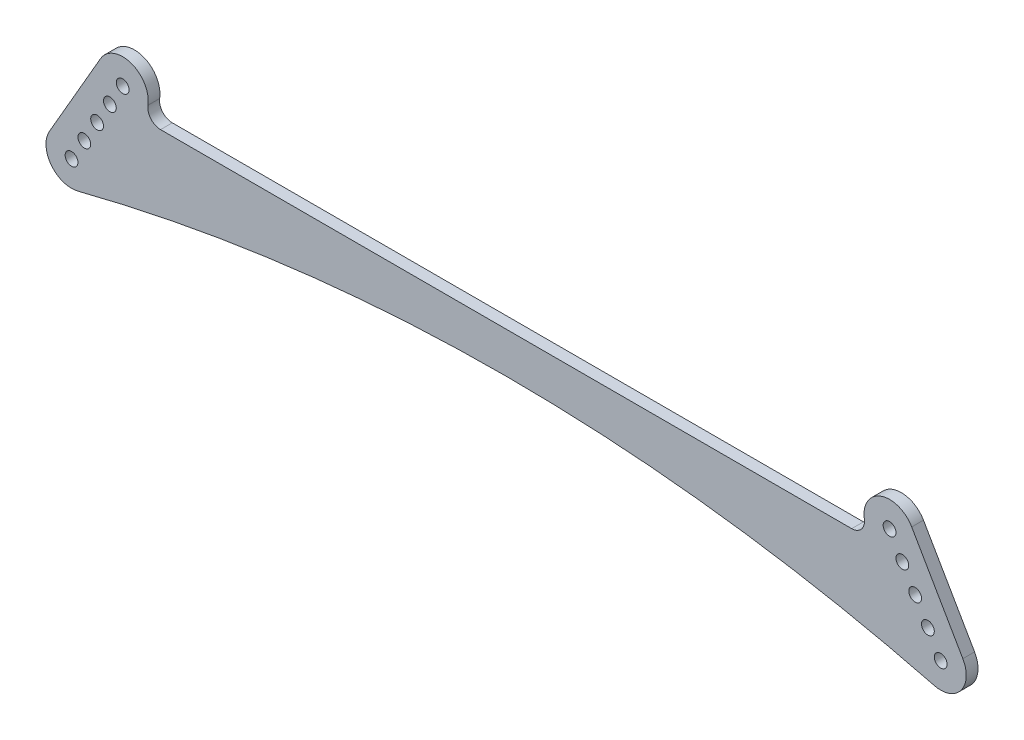
ISO-10303-21;
HEADER;
FILE_DESCRIPTION(('STEP AP214'),'2;1');
FILE_NAME('part.step','',(''),(''),'','','');
FILE_SCHEMA(('AUTOMOTIVE_DESIGN { 1 0 10303 214 1 1 1 1 }'));
ENDSEC;
DATA;
#1=APPLICATION_CONTEXT('core data for automotive mechanical design processes');
#2=APPLICATION_PROTOCOL_DEFINITION('international standard','automotive_design',2000,#1);
#3=PRODUCT_CONTEXT('',#1,'mechanical');
#4=PRODUCT('Part','Part','',(#3));
#5=PRODUCT_RELATED_PRODUCT_CATEGORY('part','',(#4));
#6=PRODUCT_DEFINITION_FORMATION('','',#4);
#7=PRODUCT_DEFINITION_CONTEXT('part definition',#1,'design');
#8=PRODUCT_DEFINITION('design','',#6,#7);
#9=PRODUCT_DEFINITION_SHAPE('','',#8);
#10=(LENGTH_UNIT() NAMED_UNIT(*) SI_UNIT(.MILLI.,.METRE.));
#11=(NAMED_UNIT(*) PLANE_ANGLE_UNIT() SI_UNIT($,.RADIAN.));
#12=(NAMED_UNIT(*) SI_UNIT($,.STERADIAN.) SOLID_ANGLE_UNIT());
#13=UNCERTAINTY_MEASURE_WITH_UNIT(LENGTH_MEASURE(1.E-05),#10,'distance_accuracy_value','');
#14=(GEOMETRIC_REPRESENTATION_CONTEXT(3) GLOBAL_UNCERTAINTY_ASSIGNED_CONTEXT((#13)) GLOBAL_UNIT_ASSIGNED_CONTEXT((#10,
#11,#12)) REPRESENTATION_CONTEXT('',''));
#15=CARTESIAN_POINT('',(0.,0.,0.));
#16=DIRECTION('',(0.,0.,1.));
#17=DIRECTION('',(1.,0.,0.));
#18=AXIS2_PLACEMENT_3D('',#15,#16,#17);
#19=CARTESIAN_POINT('',(-190.525708259698,-330.000206853842,5.842));
#20=DIRECTION('',(0.,0.,1.));
#21=DIRECTION('',(1.,0.,0.));
#22=AXIS2_PLACEMENT_3D('',#19,#20,#21);
#23=PLANE('',#22);
#24=CARTESIAN_POINT('',(-190.525708259698,-330.000206853842,5.842));
#25=DIRECTION('',(0.,0.,1.));
#26=DIRECTION('',(1.,0.,0.));
#27=AXIS2_PLACEMENT_3D('',#24,#25,#26);
#28=CIRCLE('',#27,3.17499999999997);
#29=CARTESIAN_POINT('',(-187.350708259698,-330.000206853842,5.842));
#30=VERTEX_POINT('',#29);
#31=EDGE_CURVE('E384',#30,#30,#28,.T.);
#32=ORIENTED_EDGE('',*,*,#31,.F.);
#33=EDGE_LOOP('',(#32));
#34=FACE_BOUND('',#33,.T.);
#35=CARTESIAN_POINT('',(215.925708259698,-373.994297366092,5.842));
#36=DIRECTION('',(0.,0.,1.));
#37=DIRECTION('',(-1.,0.,0.));
#38=AXIS2_PLACEMENT_3D('',#35,#36,#37);
#39=CIRCLE('',#38,3.17500000000025);
#40=CARTESIAN_POINT('',(212.750708259698,-373.994297366092,5.842));
#41=VERTEX_POINT('',#40);
#42=EDGE_CURVE('E404',#41,#41,#39,.T.);
#43=ORIENTED_EDGE('',*,*,#42,.F.);
#44=EDGE_LOOP('',(#43));
#45=FACE_BOUND('',#44,.T.);
#46=CARTESIAN_POINT('',(203.225708259698,-351.997252109967,5.842));
#47=DIRECTION('',(0.,0.,1.));
#48=DIRECTION('',(-1.,0.,0.));
#49=AXIS2_PLACEMENT_3D('',#46,#47,#48);
#50=CIRCLE('',#49,3.175);
#51=CARTESIAN_POINT('',(200.050708259698,-351.997252109967,5.842));
#52=VERTEX_POINT('',#51);
#53=EDGE_CURVE('E416',#52,#52,#50,.T.);
#54=ORIENTED_EDGE('',*,*,#53,.F.);
#55=EDGE_LOOP('',(#54));
#56=FACE_BOUND('',#55,.T.);
#57=CARTESIAN_POINT('',(-215.925708259698,-373.994297366092,5.842));
#58=DIRECTION('',(0.,0.,1.));
#59=DIRECTION('',(1.,0.,0.));
#60=AXIS2_PLACEMENT_3D('',#57,#58,#59);
#61=CIRCLE('',#60,3.17500000000025);
#62=CARTESIAN_POINT('',(-212.750708259698,-373.994297366092,5.842));
#63=VERTEX_POINT('',#62);
#64=EDGE_CURVE('E428',#63,#63,#61,.T.);
#65=ORIENTED_EDGE('',*,*,#64,.F.);
#66=EDGE_LOOP('',(#65));
#67=FACE_BOUND('',#66,.T.);
#68=CARTESIAN_POINT('',(-203.225708259698,-351.997252109967,5.842));
#69=DIRECTION('',(0.,0.,1.));
#70=DIRECTION('',(1.,0.,0.));
#71=AXIS2_PLACEMENT_3D('',#68,#69,#70);
#72=CIRCLE('',#71,3.175);
#73=CARTESIAN_POINT('',(-200.050708259698,-351.997252109967,5.842));
#74=VERTEX_POINT('',#73);
#75=EDGE_CURVE('E440',#74,#74,#72,.T.);
#76=ORIENTED_EDGE('',*,*,#75,.F.);
#77=EDGE_LOOP('',(#76));
#78=FACE_BOUND('',#77,.T.);
#79=DIRECTION('',(-1.,0.,0.));
#80=VECTOR('',#79,1.);
#81=CARTESIAN_POINT('',(-181.873832769056,-339.297252109967,5.842));
#82=LINE('',#81,#80);
#83=CARTESIAN_POINT('',(171.705043439922,-339.297252109967,5.842));
#84=VERTEX_POINT('',#83);
#85=CARTESIAN_POINT('',(-171.705043439922,-339.297252109967,5.842));
#86=VERTEX_POINT('',#85);
#87=EDGE_CURVE('E454',#84,#86,#82,.T.);
#88=ORIENTED_EDGE('',*,*,#87,.T.);
#89=CARTESIAN_POINT('',(-171.705043439922,-332.947252109967,5.842));
#90=DIRECTION('',(0.,0.,1.));
#91=DIRECTION('',(1.,0.,0.));
#92=AXIS2_PLACEMENT_3D('',#89,#90,#91);
#93=CIRCLE('',#92,6.35);
#94=CARTESIAN_POINT('',(-177.978598379847,-331.964903691259,5.842));
#95=VERTEX_POINT('',#94);
#96=EDGE_CURVE('E118',#86,#95,#93,.F.);
#97=ORIENTED_EDGE('',*,*,#96,.T.);
#98=CARTESIAN_POINT('',(-190.525708259698,-330.000206853842,5.842));
#99=DIRECTION('',(0.,0.,1.));
#100=DIRECTION('',(1.,0.,0.));
#101=AXIS2_PLACEMENT_3D('',#98,#99,#100);
#102=CIRCLE('',#101,12.7);
#103=CARTESIAN_POINT('',(-201.52423088776,-323.650206853842,5.842));
#104=VERTEX_POINT('',#103);
#105=EDGE_CURVE('E111',#95,#104,#102,.T.);
#106=ORIENTED_EDGE('',*,*,#105,.T.);
#107=DIRECTION('',(-0.500000000000008,-0.866025403784434,0.));
#108=VECTOR('',#107,1.);
#109=CARTESIAN_POINT('',(-214.22423088776,-345.647252109967,5.842));
#110=LINE('',#109,#108);
#111=CARTESIAN_POINT('',(-226.924230887761,-367.644297366091,5.842));
#112=VERTEX_POINT('',#111);
#113=EDGE_CURVE('E115',#104,#112,#110,.T.);
#114=ORIENTED_EDGE('',*,*,#113,.T.);
#115=CARTESIAN_POINT('',(-215.925708259698,-373.994297366092,5.842));
#116=DIRECTION('',(0.,0.,1.));
#117=DIRECTION('',(1.,0.,0.));
#118=AXIS2_PLACEMENT_3D('',#115,#116,#117);
#119=CIRCLE('',#118,12.7000000000004);
#120=CARTESIAN_POINT('',(-212.782184711221,-386.299103731906,5.842));
#121=VERTEX_POINT('',#120);
#122=EDGE_CURVE('E132',#112,#121,#119,.T.);
#123=ORIENTED_EDGE('',*,*,#122,.T.);
#124=CARTESIAN_POINT('',(1.49308937752045E-13,-1219.2,5.842));
#125=DIRECTION('',(0.,0.,-1.));
#126=DIRECTION('',(1.,0.,0.));
#127=AXIS2_PLACEMENT_3D('',#124,#125,#126);
#128=CIRCLE('',#127,859.651185734467);
#129=CARTESIAN_POINT('',(212.782184711221,-386.299103731906,5.842));
#130=VERTEX_POINT('',#129);
#131=EDGE_CURVE('E446',#121,#130,#128,.T.);
#132=ORIENTED_EDGE('',*,*,#131,.T.);
#133=CARTESIAN_POINT('',(215.925708259698,-373.994297366092,5.842));
#134=DIRECTION('',(0.,0.,1.));
#135=DIRECTION('',(-1.,0.,0.));
#136=AXIS2_PLACEMENT_3D('',#133,#134,#135);
#137=CIRCLE('',#136,12.7000000000004);
#138=CARTESIAN_POINT('',(226.924230887761,-367.644297366091,5.842));
#139=VERTEX_POINT('',#138);
#140=EDGE_CURVE('E448',#130,#139,#137,.T.);
#141=ORIENTED_EDGE('',*,*,#140,.T.);
#142=DIRECTION('',(-0.500000000000005,0.866025403784436,0.));
#143=VECTOR('',#142,1.);
#144=CARTESIAN_POINT('',(226.924230887761,-367.644297366091,5.842));
#145=LINE('',#144,#143);
#146=CARTESIAN_POINT('',(201.52423088776,-323.650206853842,5.842));
#147=VERTEX_POINT('',#146);
#148=EDGE_CURVE('E450',#139,#147,#145,.T.);
#149=ORIENTED_EDGE('',*,*,#148,.T.);
#150=CARTESIAN_POINT('',(190.525708259698,-330.000206853842,5.842));
#151=DIRECTION('',(0.,0.,1.));
#152=DIRECTION('',(-1.,0.,0.));
#153=AXIS2_PLACEMENT_3D('',#150,#151,#152);
#154=CIRCLE('',#153,12.7);
#155=CARTESIAN_POINT('',(177.978598379847,-331.964903691259,5.842));
#156=VERTEX_POINT('',#155);
#157=EDGE_CURVE('E452',#147,#156,#154,.T.);
#158=ORIENTED_EDGE('',*,*,#157,.T.);
#159=CARTESIAN_POINT('',(171.705043439922,-332.947252109967,5.842));
#160=DIRECTION('',(0.,0.,1.));
#161=DIRECTION('',(1.,0.,0.));
#162=AXIS2_PLACEMENT_3D('',#159,#160,#161);
#163=CIRCLE('',#162,6.35);
#164=EDGE_CURVE('E11',#156,#84,#163,.F.);
#165=ORIENTED_EDGE('',*,*,#164,.T.);
#166=EDGE_LOOP('',(#88,#97,#106,#114,#123,#132,#141,#149,#158,#165));
#167=FACE_BOUND('',#166,.T.);
#168=CARTESIAN_POINT('',(-209.575708259698,-362.995774738029,5.842));
#169=DIRECTION('',(0.,0.,1.));
#170=DIRECTION('',(1.,0.,0.));
#171=AXIS2_PLACEMENT_3D('',#168,#169,#170);
#172=CIRCLE('',#171,3.175);
#173=CARTESIAN_POINT('',(-206.400708259698,-362.995774738029,5.842));
#174=VERTEX_POINT('',#173);
#175=EDGE_CURVE('E434',#174,#174,#172,.T.);
#176=ORIENTED_EDGE('',*,*,#175,.F.);
#177=EDGE_LOOP('',(#176));
#178=FACE_BOUND('',#177,.T.);
#179=CARTESIAN_POINT('',(196.875708259698,-340.998729481904,5.842));
#180=DIRECTION('',(0.,0.,1.));
#181=DIRECTION('',(-1.,0.,0.));
#182=AXIS2_PLACEMENT_3D('',#179,#180,#181);
#183=CIRCLE('',#182,3.175);
#184=CARTESIAN_POINT('',(193.700708259698,-340.998729481904,5.842));
#185=VERTEX_POINT('',#184);
#186=EDGE_CURVE('E422',#185,#185,#183,.T.);
#187=ORIENTED_EDGE('',*,*,#186,.F.);
#188=EDGE_LOOP('',(#187));
#189=FACE_BOUND('',#188,.T.);
#190=CARTESIAN_POINT('',(209.575708259698,-362.995774738029,5.842));
#191=DIRECTION('',(0.,0.,1.));
#192=DIRECTION('',(-1.,0.,0.));
#193=AXIS2_PLACEMENT_3D('',#190,#191,#192);
#194=CIRCLE('',#193,3.175);
#195=CARTESIAN_POINT('',(206.400708259698,-362.995774738029,5.842));
#196=VERTEX_POINT('',#195);
#197=EDGE_CURVE('E410',#196,#196,#194,.T.);
#198=ORIENTED_EDGE('',*,*,#197,.F.);
#199=EDGE_LOOP('',(#198));
#200=FACE_BOUND('',#199,.T.);
#201=CARTESIAN_POINT('',(-196.875708259698,-340.998729481904,5.842));
#202=DIRECTION('',(0.,0.,1.));
#203=DIRECTION('',(1.,0.,0.));
#204=AXIS2_PLACEMENT_3D('',#201,#202,#203);
#205=CIRCLE('',#204,3.175);
#206=CARTESIAN_POINT('',(-193.700708259698,-340.998729481904,5.842));
#207=VERTEX_POINT('',#206);
#208=EDGE_CURVE('E398',#207,#207,#205,.T.);
#209=ORIENTED_EDGE('',*,*,#208,.F.);
#210=EDGE_LOOP('',(#209));
#211=FACE_BOUND('',#210,.T.);
#212=CARTESIAN_POINT('',(190.525708259698,-330.000206853842,5.842));
#213=DIRECTION('',(0.,0.,1.));
#214=DIRECTION('',(-1.,0.,0.));
#215=AXIS2_PLACEMENT_3D('',#212,#213,#214);
#216=CIRCLE('',#215,3.17499999999997);
#217=CARTESIAN_POINT('',(187.350708259698,-330.000206853842,5.842));
#218=VERTEX_POINT('',#217);
#219=EDGE_CURVE('E389',#218,#218,#216,.T.);
#220=ORIENTED_EDGE('',*,*,#219,.F.);
#221=EDGE_LOOP('',(#220));
#222=FACE_BOUND('',#221,.T.);
#223=ADVANCED_FACE('F35',(#34,#45,#56,#67,#78,#167,#178,#189,#200,#211,#222),#23,.T.);
#224=CARTESIAN_POINT('',(-190.525708259698,-330.000206853842,0.));
#225=DIRECTION('',(0.,0.,1.));
#226=DIRECTION('',(1.,0.,0.));
#227=AXIS2_PLACEMENT_3D('',#224,#225,#226);
#228=PLANE('',#227);
#229=CARTESIAN_POINT('',(-190.525708259698,-330.000206853842,0.));
#230=DIRECTION('',(0.,0.,1.));
#231=DIRECTION('',(1.,0.,0.));
#232=AXIS2_PLACEMENT_3D('',#229,#230,#231);
#233=CIRCLE('',#232,12.7);
#234=CARTESIAN_POINT('',(-177.978598379847,-331.964903691259,0.));
#235=VERTEX_POINT('',#234);
#236=CARTESIAN_POINT('',(-201.52423088776,-323.650206853842,0.));
#237=VERTEX_POINT('',#236);
#238=EDGE_CURVE('E136',#235,#237,#233,.T.);
#239=ORIENTED_EDGE('',*,*,#238,.F.);
#240=CARTESIAN_POINT('',(-171.705043439922,-332.947252109967,0.));
#241=DIRECTION('',(0.,0.,1.));
#242=DIRECTION('',(1.,0.,0.));
#243=AXIS2_PLACEMENT_3D('',#240,#241,#242);
#244=CIRCLE('',#243,6.35);
#245=CARTESIAN_POINT('',(-171.705043439922,-339.297252109967,0.));
#246=VERTEX_POINT('',#245);
#247=EDGE_CURVE('E151',#235,#246,#244,.T.);
#248=ORIENTED_EDGE('',*,*,#247,.T.);
#249=DIRECTION('',(-1.,0.,0.));
#250=VECTOR('',#249,1.);
#251=CARTESIAN_POINT('',(-181.873832769056,-339.297252109967,0.));
#252=LINE('',#251,#250);
#253=CARTESIAN_POINT('',(171.705043439922,-339.297252109967,0.));
#254=VERTEX_POINT('',#253);
#255=EDGE_CURVE('E123',#254,#246,#252,.T.);
#256=ORIENTED_EDGE('',*,*,#255,.F.);
#257=CARTESIAN_POINT('',(171.705043439922,-332.947252109967,0.));
#258=DIRECTION('',(0.,0.,1.));
#259=DIRECTION('',(1.,0.,0.));
#260=AXIS2_PLACEMENT_3D('',#257,#258,#259);
#261=CIRCLE('',#260,6.35);
#262=CARTESIAN_POINT('',(177.978598379847,-331.964903691259,0.));
#263=VERTEX_POINT('',#262);
#264=EDGE_CURVE('E43',#254,#263,#261,.T.);
#265=ORIENTED_EDGE('',*,*,#264,.T.);
#266=CARTESIAN_POINT('',(190.525708259698,-330.000206853842,0.));
#267=DIRECTION('',(0.,0.,1.));
#268=DIRECTION('',(-1.,0.,0.));
#269=AXIS2_PLACEMENT_3D('',#266,#267,#268);
#270=CIRCLE('',#269,12.7);
#271=CARTESIAN_POINT('',(201.52423088776,-323.650206853842,0.));
#272=VERTEX_POINT('',#271);
#273=EDGE_CURVE('E162',#272,#263,#270,.T.);
#274=ORIENTED_EDGE('',*,*,#273,.F.);
#275=DIRECTION('',(-0.500000000000008,0.866025403784434,0.));
#276=VECTOR('',#275,1.);
#277=CARTESIAN_POINT('',(214.22423088776,-345.647252109967,0.));
#278=LINE('',#277,#276);
#279=CARTESIAN_POINT('',(226.924230887761,-367.644297366091,0.));
#280=VERTEX_POINT('',#279);
#281=EDGE_CURVE('E467',#280,#272,#278,.T.);
#282=ORIENTED_EDGE('',*,*,#281,.F.);
#283=CARTESIAN_POINT('',(215.925708259698,-373.994297366092,0.));
#284=DIRECTION('',(0.,0.,1.));
#285=DIRECTION('',(-1.,0.,0.));
#286=AXIS2_PLACEMENT_3D('',#283,#284,#285);
#287=CIRCLE('',#286,12.7000000000004);
#288=CARTESIAN_POINT('',(212.782184711221,-386.299103731906,0.));
#289=VERTEX_POINT('',#288);
#290=EDGE_CURVE('E464',#289,#280,#287,.T.);
#291=ORIENTED_EDGE('',*,*,#290,.F.);
#292=CARTESIAN_POINT('',(1.49308937752045E-13,-1219.2,0.));
#293=DIRECTION('',(0.,0.,-1.));
#294=DIRECTION('',(1.,0.,0.));
#295=AXIS2_PLACEMENT_3D('',#292,#293,#294);
#296=CIRCLE('',#295,859.651185734467);
#297=CARTESIAN_POINT('',(-212.782184711221,-386.299103731906,0.));
#298=VERTEX_POINT('',#297);
#299=EDGE_CURVE('E462',#298,#289,#296,.T.);
#300=ORIENTED_EDGE('',*,*,#299,.F.);
#301=CARTESIAN_POINT('',(-215.925708259698,-373.994297366092,0.));
#302=DIRECTION('',(0.,0.,1.));
#303=DIRECTION('',(1.,0.,0.));
#304=AXIS2_PLACEMENT_3D('',#301,#302,#303);
#305=CIRCLE('',#304,12.7000000000004);
#306=CARTESIAN_POINT('',(-226.924230887761,-367.644297366091,0.));
#307=VERTEX_POINT('',#306);
#308=EDGE_CURVE('E460',#307,#298,#305,.T.);
#309=ORIENTED_EDGE('',*,*,#308,.F.);
#310=DIRECTION('',(-0.500000000000007,-0.866025403784434,0.));
#311=VECTOR('',#310,1.);
#312=CARTESIAN_POINT('',(-226.924230887761,-367.644297366091,0.));
#313=LINE('',#312,#311);
#314=EDGE_CURVE('E458',#237,#307,#313,.T.);
#315=ORIENTED_EDGE('',*,*,#314,.F.);
#316=EDGE_LOOP('',(#239,#248,#256,#265,#274,#282,#291,#300,#309,#315));
#317=FACE_BOUND('',#316,.T.);
#318=CARTESIAN_POINT('',(-203.225708259698,-351.997252109967,0.));
#319=DIRECTION('',(0.,0.,1.));
#320=DIRECTION('',(1.,0.,0.));
#321=AXIS2_PLACEMENT_3D('',#318,#319,#320);
#322=CIRCLE('',#321,3.175);
#323=CARTESIAN_POINT('',(-200.050708259698,-351.997252109967,0.));
#324=VERTEX_POINT('',#323);
#325=EDGE_CURVE('E437',#324,#324,#322,.T.);
#326=ORIENTED_EDGE('',*,*,#325,.T.);
#327=EDGE_LOOP('',(#326));
#328=FACE_BOUND('',#327,.T.);
#329=CARTESIAN_POINT('',(-209.575708259698,-362.995774738029,0.));
#330=DIRECTION('',(0.,0.,1.));
#331=DIRECTION('',(1.,0.,0.));
#332=AXIS2_PLACEMENT_3D('',#329,#330,#331);
#333=CIRCLE('',#332,3.175);
#334=CARTESIAN_POINT('',(-206.400708259698,-362.995774738029,0.));
#335=VERTEX_POINT('',#334);
#336=EDGE_CURVE('E431',#335,#335,#333,.T.);
#337=ORIENTED_EDGE('',*,*,#336,.T.);
#338=EDGE_LOOP('',(#337));
#339=FACE_BOUND('',#338,.T.);
#340=CARTESIAN_POINT('',(-215.925708259698,-373.994297366092,0.));
#341=DIRECTION('',(0.,0.,1.));
#342=DIRECTION('',(1.,0.,0.));
#343=AXIS2_PLACEMENT_3D('',#340,#341,#342);
#344=CIRCLE('',#343,3.17500000000025);
#345=CARTESIAN_POINT('',(-212.750708259698,-373.994297366092,0.));
#346=VERTEX_POINT('',#345);
#347=EDGE_CURVE('E425',#346,#346,#344,.T.);
#348=ORIENTED_EDGE('',*,*,#347,.T.);
#349=EDGE_LOOP('',(#348));
#350=FACE_BOUND('',#349,.T.);
#351=CARTESIAN_POINT('',(196.875708259698,-340.998729481904,0.));
#352=DIRECTION('',(0.,0.,1.));
#353=DIRECTION('',(-1.,0.,0.));
#354=AXIS2_PLACEMENT_3D('',#351,#352,#353);
#355=CIRCLE('',#354,3.175);
#356=CARTESIAN_POINT('',(193.700708259698,-340.998729481904,0.));
#357=VERTEX_POINT('',#356);
#358=EDGE_CURVE('E419',#357,#357,#355,.T.);
#359=ORIENTED_EDGE('',*,*,#358,.T.);
#360=EDGE_LOOP('',(#359));
#361=FACE_BOUND('',#360,.T.);
#362=CARTESIAN_POINT('',(203.225708259698,-351.997252109967,0.));
#363=DIRECTION('',(0.,0.,1.));
#364=DIRECTION('',(-1.,0.,0.));
#365=AXIS2_PLACEMENT_3D('',#362,#363,#364);
#366=CIRCLE('',#365,3.175);
#367=CARTESIAN_POINT('',(200.050708259698,-351.997252109967,0.));
#368=VERTEX_POINT('',#367);
#369=EDGE_CURVE('E413',#368,#368,#366,.T.);
#370=ORIENTED_EDGE('',*,*,#369,.T.);
#371=EDGE_LOOP('',(#370));
#372=FACE_BOUND('',#371,.T.);
#373=CARTESIAN_POINT('',(209.575708259698,-362.995774738029,0.));
#374=DIRECTION('',(0.,0.,1.));
#375=DIRECTION('',(-1.,0.,0.));
#376=AXIS2_PLACEMENT_3D('',#373,#374,#375);
#377=CIRCLE('',#376,3.175);
#378=CARTESIAN_POINT('',(206.400708259698,-362.995774738029,0.));
#379=VERTEX_POINT('',#378);
#380=EDGE_CURVE('E407',#379,#379,#377,.T.);
#381=ORIENTED_EDGE('',*,*,#380,.T.);
#382=EDGE_LOOP('',(#381));
#383=FACE_BOUND('',#382,.T.);
#384=CARTESIAN_POINT('',(215.925708259698,-373.994297366092,0.));
#385=DIRECTION('',(0.,0.,1.));
#386=DIRECTION('',(-1.,0.,0.));
#387=AXIS2_PLACEMENT_3D('',#384,#385,#386);
#388=CIRCLE('',#387,3.17500000000025);
#389=CARTESIAN_POINT('',(212.750708259698,-373.994297366092,0.));
#390=VERTEX_POINT('',#389);
#391=EDGE_CURVE('E401',#390,#390,#388,.T.);
#392=ORIENTED_EDGE('',*,*,#391,.T.);
#393=EDGE_LOOP('',(#392));
#394=FACE_BOUND('',#393,.T.);
#395=CARTESIAN_POINT('',(-196.875708259698,-340.998729481904,0.));
#396=DIRECTION('',(0.,0.,1.));
#397=DIRECTION('',(1.,0.,0.));
#398=AXIS2_PLACEMENT_3D('',#395,#396,#397);
#399=CIRCLE('',#398,3.175);
#400=CARTESIAN_POINT('',(-193.700708259698,-340.998729481904,0.));
#401=VERTEX_POINT('',#400);
#402=EDGE_CURVE('E391',#401,#401,#399,.T.);
#403=ORIENTED_EDGE('',*,*,#402,.T.);
#404=EDGE_LOOP('',(#403));
#405=FACE_BOUND('',#404,.T.);
#406=CARTESIAN_POINT('',(-190.525708259698,-330.000206853842,0.));
#407=DIRECTION('',(0.,0.,1.));
#408=DIRECTION('',(1.,0.,0.));
#409=AXIS2_PLACEMENT_3D('',#406,#407,#408);
#410=CIRCLE('',#409,3.17499999999997);
#411=CARTESIAN_POINT('',(-187.350708259698,-330.000206853842,0.));
#412=VERTEX_POINT('',#411);
#413=EDGE_CURVE('E387',#412,#412,#410,.T.);
#414=ORIENTED_EDGE('',*,*,#413,.T.);
#415=EDGE_LOOP('',(#414));
#416=FACE_BOUND('',#415,.T.);
#417=CARTESIAN_POINT('',(190.525708259698,-330.000206853842,0.));
#418=DIRECTION('',(0.,0.,1.));
#419=DIRECTION('',(-1.,0.,0.));
#420=AXIS2_PLACEMENT_3D('',#417,#418,#419);
#421=CIRCLE('',#420,3.17499999999997);
#422=CARTESIAN_POINT('',(187.350708259698,-330.000206853842,0.));
#423=VERTEX_POINT('',#422);
#424=EDGE_CURVE('E394',#423,#423,#421,.T.);
#425=ORIENTED_EDGE('',*,*,#424,.T.);
#426=EDGE_LOOP('',(#425));
#427=FACE_BOUND('',#426,.T.);
#428=ADVANCED_FACE('F154',(#317,#328,#339,#350,#361,#372,#383,#394,#405,#416,#427),#228,.F.);
#429=CARTESIAN_POINT('',(-190.525708259698,-330.000206853842,5.842));
#430=DIRECTION('',(0.,0.,-1.));
#431=DIRECTION('',(-1.,0.,0.));
#432=AXIS2_PLACEMENT_3D('',#429,#430,#431);
#433=CYLINDRICAL_SURFACE('',#432,12.7);
#434=ORIENTED_EDGE('',*,*,#105,.F.);
#435=DIRECTION('',(0.,0.,-1.));
#436=VECTOR('',#435,1.);
#437=CARTESIAN_POINT('',(-177.978598379847,-331.964903691259,5.842));
#438=LINE('',#437,#436);
#439=EDGE_CURVE('E138',#95,#235,#438,.T.);
#440=ORIENTED_EDGE('',*,*,#439,.T.);
#441=ORIENTED_EDGE('',*,*,#238,.T.);
#442=DIRECTION('',(0.,0.,-1.));
#443=VECTOR('',#442,1.);
#444=CARTESIAN_POINT('',(-201.52423088776,-323.650206853842,5.842));
#445=LINE('',#444,#443);
#446=EDGE_CURVE('E128',#104,#237,#445,.T.);
#447=ORIENTED_EDGE('',*,*,#446,.F.);
#448=EDGE_LOOP('',(#434,#440,#441,#447));
#449=FACE_BOUND('',#448,.T.);
#450=ADVANCED_FACE('F134',(#449),#433,.T.);
#451=CARTESIAN_POINT('',(-226.924230887761,-367.644297366091,5.842));
#452=DIRECTION('',(0.866025403784434,-0.500000000000007,0.));
#453=DIRECTION('',(0.500000000000007,0.866025403784435,0.));
#454=AXIS2_PLACEMENT_3D('',#451,#452,#453);
#455=PLANE('',#454);
#456=ORIENTED_EDGE('',*,*,#314,.T.);
#457=DIRECTION('',(0.,0.,-1.));
#458=VECTOR('',#457,1.);
#459=CARTESIAN_POINT('',(-226.924230887761,-367.644297366091,5.842));
#460=LINE('',#459,#458);
#461=EDGE_CURVE('E130',#112,#307,#460,.T.);
#462=ORIENTED_EDGE('',*,*,#461,.F.);
#463=ORIENTED_EDGE('',*,*,#113,.F.);
#464=ORIENTED_EDGE('',*,*,#446,.T.);
#465=EDGE_LOOP('',(#456,#462,#463,#464));
#466=FACE_BOUND('',#465,.T.);
#467=ADVANCED_FACE('F127',(#466),#455,.F.);
#468=CARTESIAN_POINT('',(-215.925708259698,-373.994297366092,5.842));
#469=DIRECTION('',(0.,0.,-1.));
#470=DIRECTION('',(-1.,0.,0.));
#471=AXIS2_PLACEMENT_3D('',#468,#469,#470);
#472=CYLINDRICAL_SURFACE('',#471,12.7000000000004);
#473=ORIENTED_EDGE('',*,*,#308,.T.);
#474=DIRECTION('',(0.,0.,-1.));
#475=VECTOR('',#474,1.);
#476=CARTESIAN_POINT('',(-212.782184711221,-386.299103731906,5.842));
#477=LINE('',#476,#475);
#478=EDGE_CURVE('E142',#121,#298,#477,.T.);
#479=ORIENTED_EDGE('',*,*,#478,.F.);
#480=ORIENTED_EDGE('',*,*,#122,.F.);
#481=ORIENTED_EDGE('',*,*,#461,.T.);
#482=EDGE_LOOP('',(#473,#479,#480,#481));
#483=FACE_BOUND('',#482,.T.);
#484=ADVANCED_FACE('F205',(#483),#472,.T.);
#485=CARTESIAN_POINT('',(1.49308937752045E-13,-1219.2,5.842));
#486=DIRECTION('',(0.,0.,-1.));
#487=DIRECTION('',(-1.,0.,0.));
#488=AXIS2_PLACEMENT_3D('',#485,#486,#487);
#489=CYLINDRICAL_SURFACE('',#488,859.651185734467);
#490=ORIENTED_EDGE('',*,*,#299,.T.);
#491=DIRECTION('',(0.,0.,-1.));
#492=VECTOR('',#491,1.);
#493=CARTESIAN_POINT('',(212.782184711221,-386.299103731906,5.842));
#494=LINE('',#493,#492);
#495=EDGE_CURVE('E475',#130,#289,#494,.T.);
#496=ORIENTED_EDGE('',*,*,#495,.F.);
#497=ORIENTED_EDGE('',*,*,#131,.F.);
#498=ORIENTED_EDGE('',*,*,#478,.T.);
#499=EDGE_LOOP('',(#490,#496,#497,#498));
#500=FACE_BOUND('',#499,.T.);
#501=ADVANCED_FACE('F201',(#500),#489,.F.);
#502=CARTESIAN_POINT('',(215.925708259698,-373.994297366092,5.842));
#503=DIRECTION('',(0.,0.,-1.));
#504=DIRECTION('',(-1.,0.,0.));
#505=AXIS2_PLACEMENT_3D('',#502,#503,#504);
#506=CYLINDRICAL_SURFACE('',#505,12.7000000000004);
#507=ORIENTED_EDGE('',*,*,#290,.T.);
#508=DIRECTION('',(0.,0.,-1.));
#509=VECTOR('',#508,1.);
#510=CARTESIAN_POINT('',(226.924230887761,-367.644297366091,5.842));
#511=LINE('',#510,#509);
#512=EDGE_CURVE('E472',#139,#280,#511,.T.);
#513=ORIENTED_EDGE('',*,*,#512,.F.);
#514=ORIENTED_EDGE('',*,*,#140,.F.);
#515=ORIENTED_EDGE('',*,*,#495,.T.);
#516=EDGE_LOOP('',(#507,#513,#514,#515));
#517=FACE_BOUND('',#516,.T.);
#518=ADVANCED_FACE('F197',(#517),#506,.T.);
#519=CARTESIAN_POINT('',(214.22423088776,-345.647252109967,5.842));
#520=DIRECTION('',(-0.866025403784434,-0.500000000000008,0.));
#521=DIRECTION('',(0.500000000000009,-0.866025403784434,0.));
#522=AXIS2_PLACEMENT_3D('',#519,#520,#521);
#523=PLANE('',#522);
#524=ORIENTED_EDGE('',*,*,#281,.T.);
#525=DIRECTION('',(0.,0.,-1.));
#526=VECTOR('',#525,1.);
#527=CARTESIAN_POINT('',(201.52423088776,-323.650206853842,5.842));
#528=LINE('',#527,#526);
#529=EDGE_CURVE('E456',#147,#272,#528,.T.);
#530=ORIENTED_EDGE('',*,*,#529,.F.);
#531=ORIENTED_EDGE('',*,*,#148,.F.);
#532=ORIENTED_EDGE('',*,*,#512,.T.);
#533=EDGE_LOOP('',(#524,#530,#531,#532));
#534=FACE_BOUND('',#533,.T.);
#535=ADVANCED_FACE('F194',(#534),#523,.F.);
#536=CARTESIAN_POINT('',(190.525708259698,-330.000206853842,5.842));
#537=DIRECTION('',(0.,0.,-1.));
#538=DIRECTION('',(-1.,0.,0.));
#539=AXIS2_PLACEMENT_3D('',#536,#537,#538);
#540=CYLINDRICAL_SURFACE('',#539,12.7);
#541=ORIENTED_EDGE('',*,*,#273,.T.);
#542=DIRECTION('',(0.,0.,-1.));
#543=VECTOR('',#542,1.);
#544=CARTESIAN_POINT('',(177.978598379847,-331.964903691259,5.842));
#545=LINE('',#544,#543);
#546=EDGE_CURVE('E50',#263,#156,#545,.F.);
#547=ORIENTED_EDGE('',*,*,#546,.T.);
#548=ORIENTED_EDGE('',*,*,#157,.F.);
#549=ORIENTED_EDGE('',*,*,#529,.T.);
#550=EDGE_LOOP('',(#541,#547,#548,#549));
#551=FACE_BOUND('',#550,.T.);
#552=ADVANCED_FACE('F191',(#551),#540,.T.);
#553=CARTESIAN_POINT('',(-181.873832769056,-339.297252109967,5.842));
#554=DIRECTION('',(0.,-1.,0.));
#555=DIRECTION('',(0.,0.,-1.));
#556=AXIS2_PLACEMENT_3D('',#553,#554,#555);
#557=PLANE('',#556);
#558=ORIENTED_EDGE('',*,*,#255,.T.);
#559=DIRECTION('',(0.,0.,1.));
#560=VECTOR('',#559,1.);
#561=CARTESIAN_POINT('',(-171.705043439922,-339.297252109967,5.842));
#562=LINE('',#561,#560);
#563=EDGE_CURVE('E148',#246,#86,#562,.T.);
#564=ORIENTED_EDGE('',*,*,#563,.T.);
#565=ORIENTED_EDGE('',*,*,#87,.F.);
#566=DIRECTION('',(0.,0.,1.));
#567=VECTOR('',#566,1.);
#568=CARTESIAN_POINT('',(171.705043439922,-339.297252109967,0.));
#569=LINE('',#568,#567);
#570=EDGE_CURVE('E140',#84,#254,#569,.F.);
#571=ORIENTED_EDGE('',*,*,#570,.T.);
#572=EDGE_LOOP('',(#558,#564,#565,#571));
#573=FACE_BOUND('',#572,.T.);
#574=ADVANCED_FACE('F159',(#573),#557,.F.);
#575=CARTESIAN_POINT('',(-203.225708259698,-351.997252109967,5.842));
#576=DIRECTION('',(0.,0.,-1.));
#577=DIRECTION('',(-1.,0.,0.));
#578=AXIS2_PLACEMENT_3D('',#575,#576,#577);
#579=CYLINDRICAL_SURFACE('',#578,3.175);
#580=ORIENTED_EDGE('',*,*,#75,.T.);
#581=EDGE_LOOP('',(#580));
#582=FACE_BOUND('',#581,.T.);
#583=ORIENTED_EDGE('',*,*,#325,.F.);
#584=EDGE_LOOP('',(#583));
#585=FACE_BOUND('',#584,.T.);
#586=ADVANCED_FACE('F186',(#582,#585),#579,.F.);
#587=CARTESIAN_POINT('',(-209.575708259698,-362.995774738029,5.842));
#588=DIRECTION('',(0.,0.,-1.));
#589=DIRECTION('',(-1.,0.,0.));
#590=AXIS2_PLACEMENT_3D('',#587,#588,#589);
#591=CYLINDRICAL_SURFACE('',#590,3.175);
#592=ORIENTED_EDGE('',*,*,#175,.T.);
#593=EDGE_LOOP('',(#592));
#594=FACE_BOUND('',#593,.T.);
#595=ORIENTED_EDGE('',*,*,#336,.F.);
#596=EDGE_LOOP('',(#595));
#597=FACE_BOUND('',#596,.T.);
#598=ADVANCED_FACE('F250',(#594,#597),#591,.F.);
#599=CARTESIAN_POINT('',(-215.925708259698,-373.994297366092,5.842));
#600=DIRECTION('',(0.,0.,-1.));
#601=DIRECTION('',(-1.,0.,0.));
#602=AXIS2_PLACEMENT_3D('',#599,#600,#601);
#603=CYLINDRICAL_SURFACE('',#602,3.17500000000025);
#604=ORIENTED_EDGE('',*,*,#64,.T.);
#605=EDGE_LOOP('',(#604));
#606=FACE_BOUND('',#605,.T.);
#607=ORIENTED_EDGE('',*,*,#347,.F.);
#608=EDGE_LOOP('',(#607));
#609=FACE_BOUND('',#608,.T.);
#610=ADVANCED_FACE('F257',(#606,#609),#603,.F.);
#611=CARTESIAN_POINT('',(196.875708259698,-340.998729481904,5.842));
#612=DIRECTION('',(0.,0.,-1.));
#613=DIRECTION('',(-1.,0.,0.));
#614=AXIS2_PLACEMENT_3D('',#611,#612,#613);
#615=CYLINDRICAL_SURFACE('',#614,3.175);
#616=ORIENTED_EDGE('',*,*,#186,.T.);
#617=EDGE_LOOP('',(#616));
#618=FACE_BOUND('',#617,.T.);
#619=ORIENTED_EDGE('',*,*,#358,.F.);
#620=EDGE_LOOP('',(#619));
#621=FACE_BOUND('',#620,.T.);
#622=ADVANCED_FACE('F264',(#618,#621),#615,.F.);
#623=CARTESIAN_POINT('',(203.225708259698,-351.997252109967,5.842));
#624=DIRECTION('',(0.,0.,-1.));
#625=DIRECTION('',(-1.,0.,0.));
#626=AXIS2_PLACEMENT_3D('',#623,#624,#625);
#627=CYLINDRICAL_SURFACE('',#626,3.175);
#628=ORIENTED_EDGE('',*,*,#53,.T.);
#629=EDGE_LOOP('',(#628));
#630=FACE_BOUND('',#629,.T.);
#631=ORIENTED_EDGE('',*,*,#369,.F.);
#632=EDGE_LOOP('',(#631));
#633=FACE_BOUND('',#632,.T.);
#634=ADVANCED_FACE('F272',(#630,#633),#627,.F.);
#635=CARTESIAN_POINT('',(209.575708259698,-362.995774738029,5.842));
#636=DIRECTION('',(0.,0.,-1.));
#637=DIRECTION('',(-1.,0.,0.));
#638=AXIS2_PLACEMENT_3D('',#635,#636,#637);
#639=CYLINDRICAL_SURFACE('',#638,3.175);
#640=ORIENTED_EDGE('',*,*,#197,.T.);
#641=EDGE_LOOP('',(#640));
#642=FACE_BOUND('',#641,.T.);
#643=ORIENTED_EDGE('',*,*,#380,.F.);
#644=EDGE_LOOP('',(#643));
#645=FACE_BOUND('',#644,.T.);
#646=ADVANCED_FACE('F280',(#642,#645),#639,.F.);
#647=CARTESIAN_POINT('',(215.925708259698,-373.994297366092,5.842));
#648=DIRECTION('',(0.,0.,-1.));
#649=DIRECTION('',(-1.,0.,0.));
#650=AXIS2_PLACEMENT_3D('',#647,#648,#649);
#651=CYLINDRICAL_SURFACE('',#650,3.17500000000025);
#652=ORIENTED_EDGE('',*,*,#42,.T.);
#653=EDGE_LOOP('',(#652));
#654=FACE_BOUND('',#653,.T.);
#655=ORIENTED_EDGE('',*,*,#391,.F.);
#656=EDGE_LOOP('',(#655));
#657=FACE_BOUND('',#656,.T.);
#658=ADVANCED_FACE('F288',(#654,#657),#651,.F.);
#659=CARTESIAN_POINT('',(-196.875708259698,-340.998729481904,5.842));
#660=DIRECTION('',(0.,0.,-1.));
#661=DIRECTION('',(-1.,0.,0.));
#662=AXIS2_PLACEMENT_3D('',#659,#660,#661);
#663=CYLINDRICAL_SURFACE('',#662,3.175);
#664=ORIENTED_EDGE('',*,*,#208,.T.);
#665=EDGE_LOOP('',(#664));
#666=FACE_BOUND('',#665,.T.);
#667=ORIENTED_EDGE('',*,*,#402,.F.);
#668=EDGE_LOOP('',(#667));
#669=FACE_BOUND('',#668,.T.);
#670=ADVANCED_FACE('F296',(#666,#669),#663,.F.);
#671=CARTESIAN_POINT('',(-190.525708259698,-330.000206853842,5.842));
#672=DIRECTION('',(0.,0.,-1.));
#673=DIRECTION('',(-1.,0.,0.));
#674=AXIS2_PLACEMENT_3D('',#671,#672,#673);
#675=CYLINDRICAL_SURFACE('',#674,3.17499999999997);
#676=ORIENTED_EDGE('',*,*,#31,.T.);
#677=EDGE_LOOP('',(#676));
#678=FACE_BOUND('',#677,.T.);
#679=ORIENTED_EDGE('',*,*,#413,.F.);
#680=EDGE_LOOP('',(#679));
#681=FACE_BOUND('',#680,.T.);
#682=ADVANCED_FACE('F172',(#678,#681),#675,.F.);
#683=CARTESIAN_POINT('',(190.525708259698,-330.000206853842,5.842));
#684=DIRECTION('',(0.,0.,-1.));
#685=DIRECTION('',(-1.,0.,0.));
#686=AXIS2_PLACEMENT_3D('',#683,#684,#685);
#687=CYLINDRICAL_SURFACE('',#686,3.17499999999997);
#688=ORIENTED_EDGE('',*,*,#219,.T.);
#689=EDGE_LOOP('',(#688));
#690=FACE_BOUND('',#689,.T.);
#691=ORIENTED_EDGE('',*,*,#424,.F.);
#692=EDGE_LOOP('',(#691));
#693=FACE_BOUND('',#692,.T.);
#694=ADVANCED_FACE('F166',(#690,#693),#687,.F.);
#695=CARTESIAN_POINT('',(-171.705043439922,-332.947252109967,5.842));
#696=DIRECTION('',(0.,0.,-1.));
#697=DIRECTION('',(-1.,0.,0.));
#698=AXIS2_PLACEMENT_3D('',#695,#696,#697);
#699=CYLINDRICAL_SURFACE('',#698,6.35);
#700=ORIENTED_EDGE('',*,*,#96,.F.);
#701=ORIENTED_EDGE('',*,*,#563,.F.);
#702=ORIENTED_EDGE('',*,*,#247,.F.);
#703=ORIENTED_EDGE('',*,*,#439,.F.);
#704=EDGE_LOOP('',(#700,#701,#702,#703));
#705=FACE_BOUND('',#704,.T.);
#706=ADVANCED_FACE('F164',(#705),#699,.F.);
#707=CARTESIAN_POINT('',(171.705043439922,-332.947252109967,5.842));
#708=DIRECTION('',(0.,0.,-1.));
#709=DIRECTION('',(-1.,0.,0.));
#710=AXIS2_PLACEMENT_3D('',#707,#708,#709);
#711=CYLINDRICAL_SURFACE('',#710,6.35);
#712=ORIENTED_EDGE('',*,*,#164,.F.);
#713=ORIENTED_EDGE('',*,*,#546,.F.);
#714=ORIENTED_EDGE('',*,*,#264,.F.);
#715=ORIENTED_EDGE('',*,*,#570,.F.);
#716=EDGE_LOOP('',(#712,#713,#714,#715));
#717=FACE_BOUND('',#716,.T.);
#718=ADVANCED_FACE('F37',(#717),#711,.F.);
#719=CLOSED_SHELL('',(#223,#428,#450,#467,#484,#501,#518,#535,#552,#574,#586,#598,#610,#622,
#634,#646,#658,#670,#682,#694,#706,#718));
#720=MANIFOLD_SOLID_BREP('B2',#719);
#721=ADVANCED_BREP_SHAPE_REPRESENTATION('',(#18,#720),#14);
#722=SHAPE_DEFINITION_REPRESENTATION(#9,#721);
ENDSEC;
END-ISO-10303-21;
